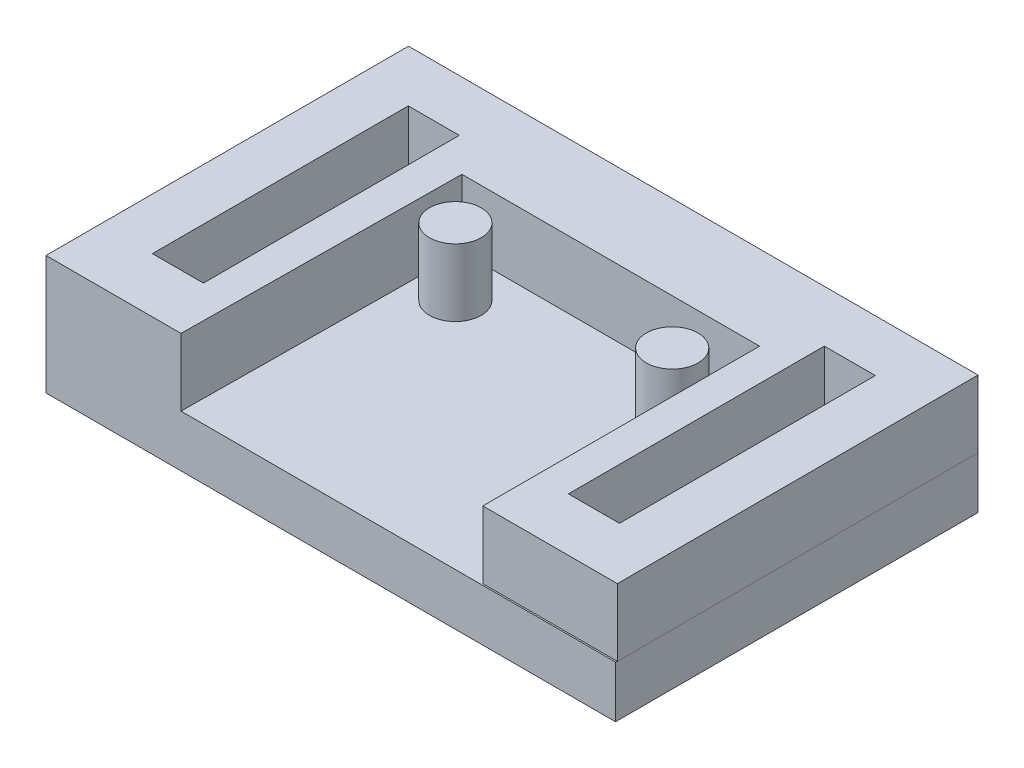
ISO-10303-21;
HEADER;
FILE_DESCRIPTION(('STEP AP214'),'2;1');
FILE_NAME('part.step','',(''),(''),'','','');
FILE_SCHEMA(('AUTOMOTIVE_DESIGN { 1 0 10303 214 1 1 1 1 }'));
ENDSEC;
DATA;
#1=APPLICATION_CONTEXT('core data for automotive mechanical design processes');
#2=APPLICATION_PROTOCOL_DEFINITION('international standard','automotive_design',2000,#1);
#3=PRODUCT_CONTEXT('',#1,'mechanical');
#4=PRODUCT('Part','Part','',(#3));
#5=PRODUCT_RELATED_PRODUCT_CATEGORY('part','',(#4));
#6=PRODUCT_DEFINITION_FORMATION('','',#4);
#7=PRODUCT_DEFINITION_CONTEXT('part definition',#1,'design');
#8=PRODUCT_DEFINITION('design','',#6,#7);
#9=PRODUCT_DEFINITION_SHAPE('','',#8);
#10=(LENGTH_UNIT() NAMED_UNIT(*) SI_UNIT(.MILLI.,.METRE.));
#11=(NAMED_UNIT(*) PLANE_ANGLE_UNIT() SI_UNIT($,.RADIAN.));
#12=(NAMED_UNIT(*) SI_UNIT($,.STERADIAN.) SOLID_ANGLE_UNIT());
#13=UNCERTAINTY_MEASURE_WITH_UNIT(LENGTH_MEASURE(1.E-05),#10,'distance_accuracy_value','');
#14=(GEOMETRIC_REPRESENTATION_CONTEXT(3) GLOBAL_UNCERTAINTY_ASSIGNED_CONTEXT((#13)) GLOBAL_UNIT_ASSIGNED_CONTEXT((#10,
#11,#12)) REPRESENTATION_CONTEXT('',''));
#15=CARTESIAN_POINT('',(0.,0.,0.));
#16=DIRECTION('',(0.,0.,1.));
#17=DIRECTION('',(1.,0.,0.));
#18=AXIS2_PLACEMENT_3D('',#15,#16,#17);
#19=CARTESIAN_POINT('',(0.,2.54,0.));
#20=DIRECTION('',(0.,-1.,0.));
#21=DIRECTION('',(0.,0.,-1.));
#22=AXIS2_PLACEMENT_3D('',#19,#20,#21);
#23=PLANE('',#22);
#24=CARTESIAN_POINT('',(-5.31894104825574,2.54,-2.54));
#25=DIRECTION('',(0.,-1.,0.));
#26=DIRECTION('',(0.,0.,-1.));
#27=AXIS2_PLACEMENT_3D('',#24,#25,#26);
#28=CIRCLE('',#27,1.27);
#29=CARTESIAN_POINT('',(-5.31894104825574,2.54,-3.81));
#30=VERTEX_POINT('',#29);
#31=EDGE_CURVE('E41',#30,#30,#28,.F.);
#32=ORIENTED_EDGE('',*,*,#31,.F.);
#33=EDGE_LOOP('',(#32));
#34=FACE_BOUND('',#33,.T.);
#35=CARTESIAN_POINT('',(5.31894104825574,2.54,-2.54));
#36=DIRECTION('',(0.,-1.,0.));
#37=DIRECTION('',(0.,0.,-1.));
#38=AXIS2_PLACEMENT_3D('',#35,#36,#37);
#39=CIRCLE('',#38,1.27);
#40=CARTESIAN_POINT('',(5.31894104825574,2.54,-3.81));
#41=VERTEX_POINT('',#40);
#42=EDGE_CURVE('E11',#41,#41,#39,.F.);
#43=ORIENTED_EDGE('',*,*,#42,.F.);
#44=EDGE_LOOP('',(#43));
#45=FACE_BOUND('',#44,.T.);
#46=DIRECTION('',(1.,0.,0.));
#47=VECTOR('',#46,1.);
#48=CARTESIAN_POINT('',(13.9882213316105,2.54,8.81711467355781));
#49=LINE('',#48,#47);
#50=CARTESIAN_POINT('',(7.38422133231234,2.54,8.81711467355781));
#51=VERTEX_POINT('',#50);
#52=CARTESIAN_POINT('',(13.97,2.54,8.81711467355781));
#53=VERTEX_POINT('',#52);
#54=EDGE_CURVE('E48',#51,#53,#49,.T.);
#55=ORIENTED_EDGE('',*,*,#54,.F.);
#56=DIRECTION('',(0.,0.,1.));
#57=VECTOR('',#56,1.);
#58=CARTESIAN_POINT('',(7.38422133231234,2.54,8.81711467355781));
#59=LINE('',#58,#57);
#60=CARTESIAN_POINT('',(7.38422133231234,2.54,-4.76033987234333));
#61=VERTEX_POINT('',#60);
#62=EDGE_CURVE('E53',#61,#51,#59,.T.);
#63=ORIENTED_EDGE('',*,*,#62,.F.);
#64=DIRECTION('',(1.,0.,0.));
#65=VECTOR('',#64,1.);
#66=CARTESIAN_POINT('',(-7.21564731777631,2.54,-4.76033987234333));
#67=LINE('',#66,#65);
#68=CARTESIAN_POINT('',(-7.21564731777631,2.54,-4.76033987234333));
#69=VERTEX_POINT('',#68);
#70=EDGE_CURVE('E265',#69,#61,#67,.T.);
#71=ORIENTED_EDGE('',*,*,#70,.F.);
#72=DIRECTION('',(0.00967925791143743,0.,-0.99995315488591));
#73=VECTOR('',#72,1.);
#74=CARTESIAN_POINT('',(-7.21564731777631,2.54,-4.76033987234333));
#75=LINE('',#74,#73);
#76=CARTESIAN_POINT('',(-7.34777866768766,2.54,8.89));
#77=VERTEX_POINT('',#76);
#78=EDGE_CURVE('E288',#77,#69,#75,.T.);
#79=ORIENTED_EDGE('',*,*,#78,.F.);
#80=DIRECTION('',(1.,0.,0.));
#81=VECTOR('',#80,1.);
#82=CARTESIAN_POINT('',(-13.97,2.54,8.89));
#83=LINE('',#82,#81);
#84=CARTESIAN_POINT('',(13.97,2.54,8.89));
#85=VERTEX_POINT('',#84);
#86=EDGE_CURVE('E378',#77,#85,#83,.T.);
#87=ORIENTED_EDGE('',*,*,#86,.T.);
#88=DIRECTION('',(0.,0.,-1.));
#89=VECTOR('',#88,1.);
#90=CARTESIAN_POINT('',(13.97,2.54,8.89));
#91=LINE('',#90,#89);
#92=EDGE_CURVE('E376',#85,#53,#91,.T.);
#93=ORIENTED_EDGE('',*,*,#92,.T.);
#94=EDGE_LOOP('',(#55,#63,#71,#79,#87,#93));
#95=FACE_BOUND('',#94,.T.);
#96=ADVANCED_FACE('F33',(#34,#45,#95),#23,.F.);
#97=CARTESIAN_POINT('',(0.,0.,0.));
#98=DIRECTION('',(0.,-1.,0.));
#99=DIRECTION('',(0.,0.,-1.));
#100=AXIS2_PLACEMENT_3D('',#97,#98,#99);
#101=PLANE('',#100);
#102=DIRECTION('',(0.,0.,-1.));
#103=VECTOR('',#102,1.);
#104=CARTESIAN_POINT('',(13.97,0.,8.89));
#105=LINE('',#104,#103);
#106=CARTESIAN_POINT('',(13.97,0.,8.89));
#107=VERTEX_POINT('',#106);
#108=CARTESIAN_POINT('',(13.97,0.,-8.89));
#109=VERTEX_POINT('',#108);
#110=EDGE_CURVE('E375',#107,#109,#105,.T.);
#111=ORIENTED_EDGE('',*,*,#110,.F.);
#112=DIRECTION('',(1.,0.,0.));
#113=VECTOR('',#112,1.);
#114=CARTESIAN_POINT('',(-13.97,0.,8.89));
#115=LINE('',#114,#113);
#116=CARTESIAN_POINT('',(-13.97,0.,8.89));
#117=VERTEX_POINT('',#116);
#118=EDGE_CURVE('E379',#117,#107,#115,.T.);
#119=ORIENTED_EDGE('',*,*,#118,.F.);
#120=DIRECTION('',(0.,0.,1.));
#121=VECTOR('',#120,1.);
#122=CARTESIAN_POINT('',(-13.97,0.,8.89));
#123=LINE('',#122,#121);
#124=CARTESIAN_POINT('',(-13.97,0.,-8.89));
#125=VERTEX_POINT('',#124);
#126=EDGE_CURVE('E386',#125,#117,#123,.T.);
#127=ORIENTED_EDGE('',*,*,#126,.F.);
#128=DIRECTION('',(-1.,0.,0.));
#129=VECTOR('',#128,1.);
#130=CARTESIAN_POINT('',(-13.97,0.,-8.89));
#131=LINE('',#130,#129);
#132=EDGE_CURVE('E384',#109,#125,#131,.T.);
#133=ORIENTED_EDGE('',*,*,#132,.F.);
#134=EDGE_LOOP('',(#111,#119,#127,#133));
#135=FACE_BOUND('',#134,.T.);
#136=DIRECTION('',(-1.,0.,0.));
#137=VECTOR('',#136,1.);
#138=CARTESIAN_POINT('',(-8.93489898989899,0.,-6.35));
#139=LINE('',#138,#137);
#140=CARTESIAN_POINT('',(-8.93489898989899,0.,-6.35));
#141=VERTEX_POINT('',#140);
#142=CARTESIAN_POINT('',(-11.474898989899,0.,-6.35));
#143=VERTEX_POINT('',#142);
#144=EDGE_CURVE('E349',#141,#143,#139,.T.);
#145=ORIENTED_EDGE('',*,*,#144,.T.);
#146=DIRECTION('',(0.,0.,1.));
#147=VECTOR('',#146,1.);
#148=CARTESIAN_POINT('',(-11.474898989899,0.,6.35));
#149=LINE('',#148,#147);
#150=CARTESIAN_POINT('',(-11.474898989899,0.,6.35));
#151=VERTEX_POINT('',#150);
#152=EDGE_CURVE('E344',#143,#151,#149,.T.);
#153=ORIENTED_EDGE('',*,*,#152,.T.);
#154=DIRECTION('',(1.,0.,0.));
#155=VECTOR('',#154,1.);
#156=CARTESIAN_POINT('',(-8.93489898989899,0.,6.35));
#157=LINE('',#156,#155);
#158=CARTESIAN_POINT('',(-8.93489898989899,0.,6.35));
#159=VERTEX_POINT('',#158);
#160=EDGE_CURVE('E358',#151,#159,#157,.T.);
#161=ORIENTED_EDGE('',*,*,#160,.T.);
#162=DIRECTION('',(0.,0.,-1.));
#163=VECTOR('',#162,1.);
#164=CARTESIAN_POINT('',(-8.93489898989899,0.,6.35));
#165=LINE('',#164,#163);
#166=EDGE_CURVE('E361',#159,#141,#165,.T.);
#167=ORIENTED_EDGE('',*,*,#166,.T.);
#168=EDGE_LOOP('',(#145,#153,#161,#167));
#169=FACE_BOUND('',#168,.T.);
#170=DIRECTION('',(-1.,0.,0.));
#171=VECTOR('',#170,1.);
#172=CARTESIAN_POINT('',(8.93489898989895,0.,-6.35));
#173=LINE('',#172,#171);
#174=CARTESIAN_POINT('',(11.4748989898989,0.,-6.35));
#175=VERTEX_POINT('',#174);
#176=CARTESIAN_POINT('',(8.93489898989895,0.,-6.35));
#177=VERTEX_POINT('',#176);
#178=EDGE_CURVE('E202',#175,#177,#173,.T.);
#179=ORIENTED_EDGE('',*,*,#178,.T.);
#180=DIRECTION('',(0.,0.,1.));
#181=VECTOR('',#180,1.);
#182=CARTESIAN_POINT('',(8.93489898989903,0.,6.35));
#183=LINE('',#182,#181);
#184=CARTESIAN_POINT('',(8.93489898989903,0.,6.35));
#185=VERTEX_POINT('',#184);
#186=EDGE_CURVE('E319',#177,#185,#183,.T.);
#187=ORIENTED_EDGE('',*,*,#186,.T.);
#188=DIRECTION('',(1.,0.,0.));
#189=VECTOR('',#188,1.);
#190=CARTESIAN_POINT('',(8.93489898989903,0.,6.35));
#191=LINE('',#190,#189);
#192=CARTESIAN_POINT('',(11.474898989899,0.,6.35));
#193=VERTEX_POINT('',#192);
#194=EDGE_CURVE('E333',#185,#193,#191,.T.);
#195=ORIENTED_EDGE('',*,*,#194,.T.);
#196=DIRECTION('',(0.,0.,-1.));
#197=VECTOR('',#196,1.);
#198=CARTESIAN_POINT('',(11.474898989899,0.,6.35));
#199=LINE('',#198,#197);
#200=EDGE_CURVE('E336',#193,#175,#199,.T.);
#201=ORIENTED_EDGE('',*,*,#200,.T.);
#202=EDGE_LOOP('',(#179,#187,#195,#201));
#203=FACE_BOUND('',#202,.T.);
#204=ADVANCED_FACE('F406',(#135,#169,#203),#101,.T.);
#205=CARTESIAN_POINT('',(13.97,2.54,8.89));
#206=DIRECTION('',(-1.,0.,0.));
#207=DIRECTION('',(0.,0.,1.));
#208=AXIS2_PLACEMENT_3D('',#205,#206,#207);
#209=PLANE('',#208);
#210=ORIENTED_EDGE('',*,*,#110,.T.);
#211=DIRECTION('',(0.,-1.,0.));
#212=VECTOR('',#211,1.);
#213=CARTESIAN_POINT('',(13.97,2.54,-8.89));
#214=LINE('',#213,#212);
#215=CARTESIAN_POINT('',(13.97,2.54,-8.89));
#216=VERTEX_POINT('',#215);
#217=EDGE_CURVE('E397',#216,#109,#214,.T.);
#218=ORIENTED_EDGE('',*,*,#217,.F.);
#219=DIRECTION('',(0.,0.,1.));
#220=VECTOR('',#219,1.);
#221=CARTESIAN_POINT('',(13.97,2.54,8.89));
#222=LINE('',#221,#220);
#223=EDGE_CURVE('E311',#216,#53,#222,.T.);
#224=ORIENTED_EDGE('',*,*,#223,.T.);
#225=ORIENTED_EDGE('',*,*,#92,.F.);
#226=DIRECTION('',(0.,-1.,0.));
#227=VECTOR('',#226,1.);
#228=CARTESIAN_POINT('',(13.97,2.54,8.89));
#229=LINE('',#228,#227);
#230=EDGE_CURVE('E381',#85,#107,#229,.T.);
#231=ORIENTED_EDGE('',*,*,#230,.T.);
#232=EDGE_LOOP('',(#210,#218,#224,#225,#231));
#233=FACE_BOUND('',#232,.T.);
#234=ADVANCED_FACE('F35',(#233),#209,.F.);
#235=CARTESIAN_POINT('',(-13.97,2.54,-8.89));
#236=DIRECTION('',(0.,0.,1.));
#237=DIRECTION('',(1.,0.,0.));
#238=AXIS2_PLACEMENT_3D('',#235,#236,#237);
#239=PLANE('',#238);
#240=ORIENTED_EDGE('',*,*,#132,.T.);
#241=DIRECTION('',(0.,-1.,0.));
#242=VECTOR('',#241,1.);
#243=CARTESIAN_POINT('',(-13.97,2.54,-8.89));
#244=LINE('',#243,#242);
#245=CARTESIAN_POINT('',(-13.97,5.842,-8.89));
#246=VERTEX_POINT('',#245);
#247=EDGE_CURVE('E394',#246,#125,#244,.T.);
#248=ORIENTED_EDGE('',*,*,#247,.F.);
#249=DIRECTION('',(-1.,0.,0.));
#250=VECTOR('',#249,1.);
#251=CARTESIAN_POINT('',(-13.97,5.842,-8.89));
#252=LINE('',#251,#250);
#253=CARTESIAN_POINT('',(13.97,5.842,-8.89));
#254=VERTEX_POINT('',#253);
#255=EDGE_CURVE('E269',#254,#246,#252,.T.);
#256=ORIENTED_EDGE('',*,*,#255,.F.);
#257=DIRECTION('',(0.,-1.,0.));
#258=VECTOR('',#257,1.);
#259=CARTESIAN_POINT('',(13.97,5.842,-8.89));
#260=LINE('',#259,#258);
#261=EDGE_CURVE('E300',#254,#216,#260,.T.);
#262=ORIENTED_EDGE('',*,*,#261,.T.);
#263=ORIENTED_EDGE('',*,*,#217,.T.);
#264=EDGE_LOOP('',(#240,#248,#256,#262,#263));
#265=FACE_BOUND('',#264,.T.);
#266=ADVANCED_FACE('F468',(#265),#239,.F.);
#267=CARTESIAN_POINT('',(-13.97,2.54,8.89));
#268=DIRECTION('',(1.,0.,0.));
#269=DIRECTION('',(0.,0.,-1.));
#270=AXIS2_PLACEMENT_3D('',#267,#268,#269);
#271=PLANE('',#270);
#272=ORIENTED_EDGE('',*,*,#126,.T.);
#273=DIRECTION('',(0.,-1.,0.));
#274=VECTOR('',#273,1.);
#275=CARTESIAN_POINT('',(-13.97,2.54,8.89));
#276=LINE('',#275,#274);
#277=CARTESIAN_POINT('',(-13.97,5.842,8.89));
#278=VERTEX_POINT('',#277);
#279=EDGE_CURVE('E391',#278,#117,#276,.T.);
#280=ORIENTED_EDGE('',*,*,#279,.F.);
#281=DIRECTION('',(0.,0.,1.));
#282=VECTOR('',#281,1.);
#283=CARTESIAN_POINT('',(-13.97,5.842,8.89));
#284=LINE('',#283,#282);
#285=EDGE_CURVE('E272',#246,#278,#284,.T.);
#286=ORIENTED_EDGE('',*,*,#285,.F.);
#287=ORIENTED_EDGE('',*,*,#247,.T.);
#288=EDGE_LOOP('',(#272,#280,#286,#287));
#289=FACE_BOUND('',#288,.T.);
#290=ADVANCED_FACE('F465',(#289),#271,.F.);
#291=CARTESIAN_POINT('',(-13.97,2.54,8.89));
#292=DIRECTION('',(0.,0.,-1.));
#293=DIRECTION('',(-1.,0.,0.));
#294=AXIS2_PLACEMENT_3D('',#291,#292,#293);
#295=PLANE('',#294);
#296=ORIENTED_EDGE('',*,*,#118,.T.);
#297=ORIENTED_EDGE('',*,*,#230,.F.);
#298=ORIENTED_EDGE('',*,*,#86,.F.);
#299=DIRECTION('',(0.,-1.,0.));
#300=VECTOR('',#299,1.);
#301=CARTESIAN_POINT('',(-7.34777866768766,5.842,8.89));
#302=LINE('',#301,#300);
#303=CARTESIAN_POINT('',(-7.34777866768766,5.842,8.89));
#304=VERTEX_POINT('',#303);
#305=EDGE_CURVE('E297',#304,#77,#302,.T.);
#306=ORIENTED_EDGE('',*,*,#305,.F.);
#307=DIRECTION('',(1.,0.,0.));
#308=VECTOR('',#307,1.);
#309=CARTESIAN_POINT('',(-7.34777866768766,5.842,8.89));
#310=LINE('',#309,#308);
#311=EDGE_CURVE('E275',#278,#304,#310,.T.);
#312=ORIENTED_EDGE('',*,*,#311,.F.);
#313=ORIENTED_EDGE('',*,*,#279,.T.);
#314=EDGE_LOOP('',(#296,#297,#298,#306,#312,#313));
#315=FACE_BOUND('',#314,.T.);
#316=ADVANCED_FACE('F457',(#315),#295,.F.);
#317=CARTESIAN_POINT('',(-11.474898989899,2.54,6.35));
#318=DIRECTION('',(1.,0.,0.));
#319=DIRECTION('',(0.,0.,-1.));
#320=AXIS2_PLACEMENT_3D('',#317,#318,#319);
#321=PLANE('',#320);
#322=ORIENTED_EDGE('',*,*,#152,.F.);
#323=DIRECTION('',(0.,-1.,0.));
#324=VECTOR('',#323,1.);
#325=CARTESIAN_POINT('',(-11.474898989899,2.54,-6.35));
#326=LINE('',#325,#324);
#327=CARTESIAN_POINT('',(-11.474898989899,2.54,-6.35));
#328=VERTEX_POINT('',#327);
#329=EDGE_CURVE('E355',#328,#143,#326,.T.);
#330=ORIENTED_EDGE('',*,*,#329,.F.);
#331=DIRECTION('',(0.,0.,1.));
#332=VECTOR('',#331,1.);
#333=CARTESIAN_POINT('',(-11.474898989899,2.54,6.35));
#334=LINE('',#333,#332);
#335=CARTESIAN_POINT('',(-11.474898989899,2.54,6.35));
#336=VERTEX_POINT('',#335);
#337=EDGE_CURVE('E345',#328,#336,#334,.T.);
#338=ORIENTED_EDGE('',*,*,#337,.T.);
#339=DIRECTION('',(0.,-1.,0.));
#340=VECTOR('',#339,1.);
#341=CARTESIAN_POINT('',(-11.474898989899,2.54,6.35));
#342=LINE('',#341,#340);
#343=EDGE_CURVE('E372',#336,#151,#342,.T.);
#344=ORIENTED_EDGE('',*,*,#343,.T.);
#345=EDGE_LOOP('',(#322,#330,#338,#344));
#346=FACE_BOUND('',#345,.T.);
#347=ADVANCED_FACE('F454',(#346),#321,.T.);
#348=CARTESIAN_POINT('',(-8.93489898989899,2.54,6.35));
#349=DIRECTION('',(0.,0.,-1.));
#350=DIRECTION('',(-1.,0.,0.));
#351=AXIS2_PLACEMENT_3D('',#348,#349,#350);
#352=PLANE('',#351);
#353=ORIENTED_EDGE('',*,*,#160,.F.);
#354=ORIENTED_EDGE('',*,*,#343,.F.);
#355=DIRECTION('',(1.,0.,0.));
#356=VECTOR('',#355,1.);
#357=CARTESIAN_POINT('',(-8.93489898989899,2.54,6.35));
#358=LINE('',#357,#356);
#359=CARTESIAN_POINT('',(-8.93489898989899,2.54,6.35));
#360=VERTEX_POINT('',#359);
#361=EDGE_CURVE('E348',#336,#360,#358,.T.);
#362=ORIENTED_EDGE('',*,*,#361,.T.);
#363=DIRECTION('',(0.,-1.,0.));
#364=VECTOR('',#363,1.);
#365=CARTESIAN_POINT('',(-8.93489898989899,2.54,6.35));
#366=LINE('',#365,#364);
#367=EDGE_CURVE('E370',#360,#159,#366,.T.);
#368=ORIENTED_EDGE('',*,*,#367,.T.);
#369=EDGE_LOOP('',(#353,#354,#362,#368));
#370=FACE_BOUND('',#369,.T.);
#371=ADVANCED_FACE('F450',(#370),#352,.T.);
#372=CARTESIAN_POINT('',(-8.93489898989899,2.54,6.35));
#373=DIRECTION('',(-1.,0.,0.));
#374=DIRECTION('',(0.,0.,1.));
#375=AXIS2_PLACEMENT_3D('',#372,#373,#374);
#376=PLANE('',#375);
#377=ORIENTED_EDGE('',*,*,#166,.F.);
#378=ORIENTED_EDGE('',*,*,#367,.F.);
#379=DIRECTION('',(0.,0.,-1.));
#380=VECTOR('',#379,1.);
#381=CARTESIAN_POINT('',(-8.93489898989899,2.54,6.35));
#382=LINE('',#381,#380);
#383=CARTESIAN_POINT('',(-8.93489898989899,2.54,6.20422934711563));
#384=VERTEX_POINT('',#383);
#385=EDGE_CURVE('E352',#360,#384,#382,.T.);
#386=ORIENTED_EDGE('',*,*,#385,.T.);
#387=DIRECTION('',(0.,-1.,0.));
#388=VECTOR('',#387,1.);
#389=CARTESIAN_POINT('',(-8.93489898989899,5.842,6.20422934711563));
#390=LINE('',#389,#388);
#391=CARTESIAN_POINT('',(-8.93489898989899,5.842,6.20422934711563));
#392=VERTEX_POINT('',#391);
#393=EDGE_CURVE('E250',#392,#384,#390,.T.);
#394=ORIENTED_EDGE('',*,*,#393,.F.);
#395=DIRECTION('',(0.,0.,-1.));
#396=VECTOR('',#395,1.);
#397=CARTESIAN_POINT('',(-8.93489898989899,5.842,6.20422934711563));
#398=LINE('',#397,#396);
#399=CARTESIAN_POINT('',(-8.93489898989899,5.842,-6.35));
#400=VERTEX_POINT('',#399);
#401=EDGE_CURVE('E239',#392,#400,#398,.T.);
#402=ORIENTED_EDGE('',*,*,#401,.T.);
#403=DIRECTION('',(0.,-1.,0.));
#404=VECTOR('',#403,1.);
#405=CARTESIAN_POINT('',(-8.93489898989899,2.54,-6.35));
#406=LINE('',#405,#404);
#407=EDGE_CURVE('E368',#400,#141,#406,.T.);
#408=ORIENTED_EDGE('',*,*,#407,.T.);
#409=EDGE_LOOP('',(#377,#378,#386,#394,#402,#408));
#410=FACE_BOUND('',#409,.T.);
#411=ADVANCED_FACE('F446',(#410),#376,.T.);
#412=CARTESIAN_POINT('',(-8.93489898989899,2.54,-6.35));
#413=DIRECTION('',(0.,0.,1.));
#414=DIRECTION('',(1.,0.,0.));
#415=AXIS2_PLACEMENT_3D('',#412,#413,#414);
#416=PLANE('',#415);
#417=ORIENTED_EDGE('',*,*,#144,.F.);
#418=ORIENTED_EDGE('',*,*,#407,.F.);
#419=DIRECTION('',(-1.,0.,0.));
#420=VECTOR('',#419,1.);
#421=CARTESIAN_POINT('',(-11.4384563266779,5.842,-6.35));
#422=LINE('',#421,#420);
#423=CARTESIAN_POINT('',(-11.4384563266779,5.842,-6.35));
#424=VERTEX_POINT('',#423);
#425=EDGE_CURVE('E242',#400,#424,#422,.T.);
#426=ORIENTED_EDGE('',*,*,#425,.T.);
#427=DIRECTION('',(0.,-1.,0.));
#428=VECTOR('',#427,1.);
#429=CARTESIAN_POINT('',(-11.4384563266779,5.842,-6.35));
#430=LINE('',#429,#428);
#431=CARTESIAN_POINT('',(-11.4384563266779,2.54,-6.35));
#432=VERTEX_POINT('',#431);
#433=EDGE_CURVE('E258',#424,#432,#430,.T.);
#434=ORIENTED_EDGE('',*,*,#433,.T.);
#435=DIRECTION('',(1.,0.,0.));
#436=VECTOR('',#435,1.);
#437=CARTESIAN_POINT('',(-8.93489898989899,2.54,-6.35));
#438=LINE('',#437,#436);
#439=EDGE_CURVE('E308',#328,#432,#438,.T.);
#440=ORIENTED_EDGE('',*,*,#439,.F.);
#441=ORIENTED_EDGE('',*,*,#329,.T.);
#442=EDGE_LOOP('',(#417,#418,#426,#434,#440,#441));
#443=FACE_BOUND('',#442,.T.);
#444=ADVANCED_FACE('F442',(#443),#416,.T.);
#445=CARTESIAN_POINT('',(8.93489898989903,2.54,6.35));
#446=DIRECTION('',(1.,0.,0.));
#447=DIRECTION('',(0.,0.,-1.));
#448=AXIS2_PLACEMENT_3D('',#445,#446,#447);
#449=PLANE('',#448);
#450=ORIENTED_EDGE('',*,*,#186,.F.);
#451=DIRECTION('',(0.,-1.,0.));
#452=VECTOR('',#451,1.);
#453=CARTESIAN_POINT('',(8.93489898989895,2.54,-6.35));
#454=LINE('',#453,#452);
#455=CARTESIAN_POINT('',(8.93489898989895,2.54,-6.35));
#456=VERTEX_POINT('',#455);
#457=EDGE_CURVE('E207',#456,#177,#454,.T.);
#458=ORIENTED_EDGE('',*,*,#457,.F.);
#459=DIRECTION('',(0.,0.,1.));
#460=VECTOR('',#459,1.);
#461=CARTESIAN_POINT('',(8.93489898989903,2.54,6.35));
#462=LINE('',#461,#460);
#463=CARTESIAN_POINT('',(8.93489898989903,2.54,6.35));
#464=VERTEX_POINT('',#463);
#465=EDGE_CURVE('E320',#456,#464,#462,.T.);
#466=ORIENTED_EDGE('',*,*,#465,.T.);
#467=DIRECTION('',(0.,-1.,0.));
#468=VECTOR('',#467,1.);
#469=CARTESIAN_POINT('',(8.93489898989903,2.54,6.35));
#470=LINE('',#469,#468);
#471=EDGE_CURVE('E341',#464,#185,#470,.T.);
#472=ORIENTED_EDGE('',*,*,#471,.T.);
#473=EDGE_LOOP('',(#450,#458,#466,#472));
#474=FACE_BOUND('',#473,.T.);
#475=ADVANCED_FACE('F438',(#474),#449,.T.);
#476=CARTESIAN_POINT('',(8.93489898989903,2.54,6.35));
#477=DIRECTION('',(0.,0.,-1.));
#478=DIRECTION('',(-1.,0.,0.));
#479=AXIS2_PLACEMENT_3D('',#476,#477,#478);
#480=PLANE('',#479);
#481=ORIENTED_EDGE('',*,*,#194,.F.);
#482=ORIENTED_EDGE('',*,*,#471,.F.);
#483=DIRECTION('',(1.,0.,0.));
#484=VECTOR('',#483,1.);
#485=CARTESIAN_POINT('',(8.93489898989903,2.54,6.35));
#486=LINE('',#485,#484);
#487=CARTESIAN_POINT('',(11.474898989899,2.54,6.35));
#488=VERTEX_POINT('',#487);
#489=EDGE_CURVE('E323',#464,#488,#486,.T.);
#490=ORIENTED_EDGE('',*,*,#489,.T.);
#491=DIRECTION('',(0.,-1.,0.));
#492=VECTOR('',#491,1.);
#493=CARTESIAN_POINT('',(11.474898989899,2.54,6.35));
#494=LINE('',#493,#492);
#495=EDGE_CURVE('E206',#488,#193,#494,.T.);
#496=ORIENTED_EDGE('',*,*,#495,.T.);
#497=EDGE_LOOP('',(#481,#482,#490,#496));
#498=FACE_BOUND('',#497,.T.);
#499=ADVANCED_FACE('F435',(#498),#480,.T.);
#500=CARTESIAN_POINT('',(11.474898989899,2.54,6.35));
#501=DIRECTION('',(-1.,0.,0.));
#502=DIRECTION('',(0.,0.,1.));
#503=AXIS2_PLACEMENT_3D('',#500,#501,#502);
#504=PLANE('',#503);
#505=ORIENTED_EDGE('',*,*,#200,.F.);
#506=ORIENTED_EDGE('',*,*,#495,.F.);
#507=DIRECTION('',(0.,0.,-1.));
#508=VECTOR('',#507,1.);
#509=CARTESIAN_POINT('',(11.474898989899,2.54,6.35));
#510=LINE('',#509,#508);
#511=CARTESIAN_POINT('',(11.474898989899,2.54,6.20422934711559));
#512=VERTEX_POINT('',#511);
#513=EDGE_CURVE('E326',#488,#512,#510,.T.);
#514=ORIENTED_EDGE('',*,*,#513,.T.);
#515=DIRECTION('',(0.,-1.,0.));
#516=VECTOR('',#515,1.);
#517=CARTESIAN_POINT('',(11.474898989899,5.842,6.20422934711559));
#518=LINE('',#517,#516);
#519=CARTESIAN_POINT('',(11.474898989899,5.842,6.20422934711559));
#520=VERTEX_POINT('',#519);
#521=EDGE_CURVE('E214',#520,#512,#518,.T.);
#522=ORIENTED_EDGE('',*,*,#521,.F.);
#523=DIRECTION('',(0.,0.,-1.));
#524=VECTOR('',#523,1.);
#525=CARTESIAN_POINT('',(11.474898989899,5.842,6.20422934711559));
#526=LINE('',#525,#524);
#527=CARTESIAN_POINT('',(11.474898989899,5.842,-6.35000000000003));
#528=VERTEX_POINT('',#527);
#529=EDGE_CURVE('E211',#520,#528,#526,.T.);
#530=ORIENTED_EDGE('',*,*,#529,.T.);
#531=DIRECTION('',(0.,-1.,0.));
#532=VECTOR('',#531,1.);
#533=CARTESIAN_POINT('',(11.4748989898989,2.54,-6.35));
#534=LINE('',#533,#532);
#535=EDGE_CURVE('E193',#528,#175,#534,.T.);
#536=ORIENTED_EDGE('',*,*,#535,.T.);
#537=EDGE_LOOP('',(#505,#506,#514,#522,#530,#536));
#538=FACE_BOUND('',#537,.T.);
#539=ADVANCED_FACE('F212',(#538),#504,.T.);
#540=CARTESIAN_POINT('',(8.93489898989895,2.54,-6.35));
#541=DIRECTION('',(0.,0.,1.));
#542=DIRECTION('',(1.,0.,0.));
#543=AXIS2_PLACEMENT_3D('',#540,#541,#542);
#544=PLANE('',#543);
#545=ORIENTED_EDGE('',*,*,#178,.F.);
#546=ORIENTED_EDGE('',*,*,#535,.F.);
#547=DIRECTION('',(-1.,0.,0.));
#548=VECTOR('',#547,1.);
#549=CARTESIAN_POINT('',(11.474898989899,5.842,-6.35000000000003));
#550=LINE('',#549,#548);
#551=CARTESIAN_POINT('',(8.97134165312008,5.842,-6.35000000000002));
#552=VERTEX_POINT('',#551);
#553=EDGE_CURVE('E198',#528,#552,#550,.T.);
#554=ORIENTED_EDGE('',*,*,#553,.T.);
#555=DIRECTION('',(0.,-1.,0.));
#556=VECTOR('',#555,1.);
#557=CARTESIAN_POINT('',(8.97134165312008,5.842,-6.35000000000002));
#558=LINE('',#557,#556);
#559=CARTESIAN_POINT('',(8.97134165312008,2.54,-6.35));
#560=VERTEX_POINT('',#559);
#561=EDGE_CURVE('E236',#552,#560,#558,.T.);
#562=ORIENTED_EDGE('',*,*,#561,.T.);
#563=DIRECTION('',(-1.,0.,0.));
#564=VECTOR('',#563,1.);
#565=CARTESIAN_POINT('',(8.93489898989895,2.54,-6.35));
#566=LINE('',#565,#564);
#567=EDGE_CURVE('E328',#560,#456,#566,.T.);
#568=ORIENTED_EDGE('',*,*,#567,.T.);
#569=ORIENTED_EDGE('',*,*,#457,.T.);
#570=EDGE_LOOP('',(#545,#546,#554,#562,#568,#569));
#571=FACE_BOUND('',#570,.T.);
#572=ADVANCED_FACE('F195',(#571),#544,.T.);
#573=CARTESIAN_POINT('',(-5.31894104825574,5.842,-2.54));
#574=DIRECTION('',(0.,-1.,0.));
#575=DIRECTION('',(0.,0.,-1.));
#576=AXIS2_PLACEMENT_3D('',#573,#574,#575);
#577=CYLINDRICAL_SURFACE('',#576,1.27);
#578=CARTESIAN_POINT('',(-5.31894104825574,5.842,-2.54));
#579=DIRECTION('',(0.,1.,0.));
#580=DIRECTION('',(0.,0.,1.));
#581=AXIS2_PLACEMENT_3D('',#578,#579,#580);
#582=CIRCLE('',#581,1.27);
#583=CARTESIAN_POINT('',(-5.31894104825574,5.842,-3.81));
#584=VERTEX_POINT('',#583);
#585=EDGE_CURVE('E316',#584,#584,#582,.T.);
#586=CARTESIAN_POINT('',(-5.31894104825574,5.842,-3.81));
#587=CARTESIAN_POINT('',(-5.31894104825574,5.80760416666667,-3.81));
#588=CARTESIAN_POINT('',(-5.31894104825574,5.77320833333333,-3.81));
#589=CARTESIAN_POINT('',(-5.31894104825574,5.70441666666667,-3.81));
#590=CARTESIAN_POINT('',(-5.31894104825574,5.67002083333333,-3.81));
#591=CARTESIAN_POINT('',(-5.31894104825574,5.60122916666667,-3.81));
#592=CARTESIAN_POINT('',(-5.31894104825574,5.56683333333333,-3.81));
#593=CARTESIAN_POINT('',(-5.31894104825574,5.49804166666667,-3.81));
#594=CARTESIAN_POINT('',(-5.31894104825574,5.46364583333333,-3.81));
#595=CARTESIAN_POINT('',(-5.31894104825574,5.39485416666667,-3.81));
#596=CARTESIAN_POINT('',(-5.31894104825574,5.36045833333333,-3.81));
#597=CARTESIAN_POINT('',(-5.31894104825574,5.29166666666667,-3.81));
#598=CARTESIAN_POINT('',(-5.31894104825574,5.25727083333333,-3.81));
#599=CARTESIAN_POINT('',(-5.31894104825574,5.18847916666667,-3.81));
#600=CARTESIAN_POINT('',(-5.31894104825574,5.15408333333333,-3.81));
#601=CARTESIAN_POINT('',(-5.31894104825574,5.08529166666667,-3.81));
#602=CARTESIAN_POINT('',(-5.31894104825574,5.05089583333333,-3.81));
#603=CARTESIAN_POINT('',(-5.31894104825574,4.98210416666667,-3.81));
#604=CARTESIAN_POINT('',(-5.31894104825574,4.94770833333333,-3.81));
#605=CARTESIAN_POINT('',(-5.31894104825574,4.87891666666667,-3.81));
#606=CARTESIAN_POINT('',(-5.31894104825574,4.84452083333333,-3.81));
#607=CARTESIAN_POINT('',(-5.31894104825574,4.77572916666667,-3.81));
#608=CARTESIAN_POINT('',(-5.31894104825574,4.74133333333333,-3.81));
#609=CARTESIAN_POINT('',(-5.31894104825574,4.67254166666667,-3.81));
#610=CARTESIAN_POINT('',(-5.31894104825574,4.63814583333333,-3.81));
#611=CARTESIAN_POINT('',(-5.31894104825574,4.56935416666667,-3.81));
#612=CARTESIAN_POINT('',(-5.31894104825574,4.53495833333333,-3.81));
#613=CARTESIAN_POINT('',(-5.31894104825574,4.46616666666667,-3.81));
#614=CARTESIAN_POINT('',(-5.31894104825574,4.43177083333333,-3.81));
#615=CARTESIAN_POINT('',(-5.31894104825574,4.36297916666667,-3.81));
#616=CARTESIAN_POINT('',(-5.31894104825574,4.32858333333333,-3.81));
#617=CARTESIAN_POINT('',(-5.31894104825574,4.25979166666667,-3.81));
#618=CARTESIAN_POINT('',(-5.31894104825574,4.22539583333333,-3.81));
#619=CARTESIAN_POINT('',(-5.31894104825574,4.15660416666667,-3.81));
#620=CARTESIAN_POINT('',(-5.31894104825574,4.12220833333333,-3.81));
#621=CARTESIAN_POINT('',(-5.31894104825574,4.05341666666667,-3.81));
#622=CARTESIAN_POINT('',(-5.31894104825574,4.01902083333333,-3.81));
#623=CARTESIAN_POINT('',(-5.31894104825574,3.95022916666667,-3.81));
#624=CARTESIAN_POINT('',(-5.31894104825574,3.91583333333333,-3.81));
#625=CARTESIAN_POINT('',(-5.31894104825574,3.84704166666667,-3.81));
#626=CARTESIAN_POINT('',(-5.31894104825574,3.81264583333333,-3.81));
#627=CARTESIAN_POINT('',(-5.31894104825574,3.74385416666667,-3.81));
#628=CARTESIAN_POINT('',(-5.31894104825574,3.70945833333333,-3.81));
#629=CARTESIAN_POINT('',(-5.31894104825574,3.64066666666667,-3.81));
#630=CARTESIAN_POINT('',(-5.31894104825574,3.60627083333333,-3.81));
#631=CARTESIAN_POINT('',(-5.31894104825574,3.53747916666667,-3.81));
#632=CARTESIAN_POINT('',(-5.31894104825574,3.50308333333333,-3.81));
#633=CARTESIAN_POINT('',(-5.31894104825574,3.43429166666667,-3.81));
#634=CARTESIAN_POINT('',(-5.31894104825574,3.39989583333333,-3.81));
#635=CARTESIAN_POINT('',(-5.31894104825574,3.33110416666667,-3.81));
#636=CARTESIAN_POINT('',(-5.31894104825574,3.29670833333333,-3.81));
#637=CARTESIAN_POINT('',(-5.31894104825574,3.22791666666667,-3.81));
#638=CARTESIAN_POINT('',(-5.31894104825574,3.19352083333333,-3.81));
#639=CARTESIAN_POINT('',(-5.31894104825574,3.12472916666667,-3.81));
#640=CARTESIAN_POINT('',(-5.31894104825574,3.09033333333333,-3.81));
#641=CARTESIAN_POINT('',(-5.31894104825574,3.02154166666667,-3.81));
#642=CARTESIAN_POINT('',(-5.31894104825574,2.98714583333333,-3.81));
#643=CARTESIAN_POINT('',(-5.31894104825574,2.91835416666667,-3.81));
#644=CARTESIAN_POINT('',(-5.31894104825574,2.88395833333333,-3.81));
#645=CARTESIAN_POINT('',(-5.31894104825574,2.81516666666667,-3.81));
#646=CARTESIAN_POINT('',(-5.31894104825574,2.78077083333333,-3.81));
#647=CARTESIAN_POINT('',(-5.31894104825574,2.71197916666667,-3.81));
#648=CARTESIAN_POINT('',(-5.31894104825574,2.67758333333333,-3.81));
#649=CARTESIAN_POINT('',(-5.31894104825574,2.60879166666667,-3.81));
#650=CARTESIAN_POINT('',(-5.31894104825574,2.57439583333333,-3.81));
#651=CARTESIAN_POINT('',(-5.31894104825574,2.54,-3.81));
#652=B_SPLINE_CURVE_WITH_KNOTS('',3,(#586,#587,#588,#589,#590,#591,#592,#593,#594,#595,#596,
#597,#598,#599,#600,#601,#602,#603,#604,#605,#606,#607,#608,#609,#610,#611,#612,#613,#614,#615,
#616,#617,#618,#619,#620,#621,#622,#623,#624,#625,#626,#627,#628,#629,#630,#631,#632,#633,#634,
#635,#636,#637,#638,#639,#640,#641,#642,#643,#644,#645,#646,#647,#648,#649,#650,#651),
.UNSPECIFIED.,.F.,.F.,(4,2,2,2,2,2,2,2,2,2,2,2,2,2,2,2,2,2,2,2,2,2,2,2,2,2,2,2,2,2,2,2,4),(0.,
0.103187500000001,0.206375,0.309562500000001,0.41275,0.515937500000001,0.619125,
0.722312500000001,0.8255,0.928687500000001,1.031875,1.1350625,1.23825,1.3414375,1.444625,
1.5478125,1.651,1.7541875,1.857375,1.9605625,2.06375,2.1669375,2.270125,2.3733125,2.4765,
2.5796875,2.682875,2.7860625,2.88925,2.9924375,3.095625,3.1988125,3.302),.UNSPECIFIED.);
#653=EDGE_CURVE('BSEAM402',#584,#30,#652,.T.);
#654=ORIENTED_EDGE('',*,*,#585,.F.);
#655=ORIENTED_EDGE('',*,*,#31,.T.);
#656=ORIENTED_EDGE('',*,*,#653,.T.);
#657=ORIENTED_EDGE('',*,*,#653,.F.);
#658=EDGE_LOOP('',(#654,#656,#655,#657));
#659=FACE_BOUND('',#658,.T.);
#660=ADVANCED_FACE('F402',(#659),#577,.T.);
#661=CARTESIAN_POINT('',(-5.31894104825574,5.842,-2.54));
#662=DIRECTION('',(0.,1.,0.));
#663=DIRECTION('',(0.,0.,1.));
#664=AXIS2_PLACEMENT_3D('',#661,#662,#663);
#665=PLANE('',#664);
#666=ORIENTED_EDGE('',*,*,#585,.T.);
#667=EDGE_LOOP('',(#666));
#668=FACE_BOUND('',#667,.T.);
#669=ADVANCED_FACE('F413',(#668),#665,.T.);
#670=CARTESIAN_POINT('',(5.31894104825574,5.842,-2.54));
#671=DIRECTION('',(0.,-1.,0.));
#672=DIRECTION('',(0.,0.,-1.));
#673=AXIS2_PLACEMENT_3D('',#670,#671,#672);
#674=CYLINDRICAL_SURFACE('',#673,1.27);
#675=CARTESIAN_POINT('',(5.31894104825574,5.842,-2.54));
#676=DIRECTION('',(0.,1.,0.));
#677=DIRECTION('',(0.,0.,-1.));
#678=AXIS2_PLACEMENT_3D('',#675,#676,#677);
#679=CIRCLE('',#678,1.27);
#680=CARTESIAN_POINT('',(5.31894104825574,5.842,-3.81));
#681=VERTEX_POINT('',#680);
#682=EDGE_CURVE('E313',#681,#681,#679,.T.);
#683=CARTESIAN_POINT('',(5.31894104825574,5.842,-3.81));
#684=CARTESIAN_POINT('',(5.31894104825574,5.80760416666667,-3.81));
#685=CARTESIAN_POINT('',(5.31894104825574,5.77320833333333,-3.81));
#686=CARTESIAN_POINT('',(5.31894104825574,5.70441666666667,-3.81));
#687=CARTESIAN_POINT('',(5.31894104825574,5.67002083333333,-3.81));
#688=CARTESIAN_POINT('',(5.31894104825574,5.60122916666667,-3.81));
#689=CARTESIAN_POINT('',(5.31894104825574,5.56683333333333,-3.81));
#690=CARTESIAN_POINT('',(5.31894104825574,5.49804166666667,-3.81));
#691=CARTESIAN_POINT('',(5.31894104825574,5.46364583333333,-3.81));
#692=CARTESIAN_POINT('',(5.31894104825574,5.39485416666667,-3.81));
#693=CARTESIAN_POINT('',(5.31894104825574,5.36045833333333,-3.81));
#694=CARTESIAN_POINT('',(5.31894104825574,5.29166666666667,-3.81));
#695=CARTESIAN_POINT('',(5.31894104825574,5.25727083333333,-3.81));
#696=CARTESIAN_POINT('',(5.31894104825574,5.18847916666667,-3.81));
#697=CARTESIAN_POINT('',(5.31894104825574,5.15408333333333,-3.81));
#698=CARTESIAN_POINT('',(5.31894104825574,5.08529166666667,-3.81));
#699=CARTESIAN_POINT('',(5.31894104825574,5.05089583333333,-3.81));
#700=CARTESIAN_POINT('',(5.31894104825574,4.98210416666667,-3.81));
#701=CARTESIAN_POINT('',(5.31894104825574,4.94770833333333,-3.81));
#702=CARTESIAN_POINT('',(5.31894104825574,4.87891666666667,-3.81));
#703=CARTESIAN_POINT('',(5.31894104825574,4.84452083333333,-3.81));
#704=CARTESIAN_POINT('',(5.31894104825574,4.77572916666667,-3.81));
#705=CARTESIAN_POINT('',(5.31894104825574,4.74133333333333,-3.81));
#706=CARTESIAN_POINT('',(5.31894104825574,4.67254166666667,-3.81));
#707=CARTESIAN_POINT('',(5.31894104825574,4.63814583333333,-3.81));
#708=CARTESIAN_POINT('',(5.31894104825574,4.56935416666667,-3.81));
#709=CARTESIAN_POINT('',(5.31894104825574,4.53495833333333,-3.81));
#710=CARTESIAN_POINT('',(5.31894104825574,4.46616666666667,-3.81));
#711=CARTESIAN_POINT('',(5.31894104825574,4.43177083333333,-3.81));
#712=CARTESIAN_POINT('',(5.31894104825574,4.36297916666667,-3.81));
#713=CARTESIAN_POINT('',(5.31894104825574,4.32858333333333,-3.81));
#714=CARTESIAN_POINT('',(5.31894104825574,4.25979166666667,-3.81));
#715=CARTESIAN_POINT('',(5.31894104825574,4.22539583333333,-3.81));
#716=CARTESIAN_POINT('',(5.31894104825574,4.15660416666667,-3.81));
#717=CARTESIAN_POINT('',(5.31894104825574,4.12220833333333,-3.81));
#718=CARTESIAN_POINT('',(5.31894104825574,4.05341666666667,-3.81));
#719=CARTESIAN_POINT('',(5.31894104825574,4.01902083333333,-3.81));
#720=CARTESIAN_POINT('',(5.31894104825574,3.95022916666667,-3.81));
#721=CARTESIAN_POINT('',(5.31894104825574,3.91583333333333,-3.81));
#722=CARTESIAN_POINT('',(5.31894104825574,3.84704166666667,-3.81));
#723=CARTESIAN_POINT('',(5.31894104825574,3.81264583333333,-3.81));
#724=CARTESIAN_POINT('',(5.31894104825574,3.74385416666667,-3.81));
#725=CARTESIAN_POINT('',(5.31894104825574,3.70945833333333,-3.81));
#726=CARTESIAN_POINT('',(5.31894104825574,3.64066666666667,-3.81));
#727=CARTESIAN_POINT('',(5.31894104825574,3.60627083333333,-3.81));
#728=CARTESIAN_POINT('',(5.31894104825574,3.53747916666667,-3.81));
#729=CARTESIAN_POINT('',(5.31894104825574,3.50308333333333,-3.81));
#730=CARTESIAN_POINT('',(5.31894104825574,3.43429166666667,-3.81));
#731=CARTESIAN_POINT('',(5.31894104825574,3.39989583333333,-3.81));
#732=CARTESIAN_POINT('',(5.31894104825574,3.33110416666667,-3.81));
#733=CARTESIAN_POINT('',(5.31894104825574,3.29670833333333,-3.81));
#734=CARTESIAN_POINT('',(5.31894104825574,3.22791666666667,-3.81));
#735=CARTESIAN_POINT('',(5.31894104825574,3.19352083333333,-3.81));
#736=CARTESIAN_POINT('',(5.31894104825574,3.12472916666667,-3.81));
#737=CARTESIAN_POINT('',(5.31894104825574,3.09033333333333,-3.81));
#738=CARTESIAN_POINT('',(5.31894104825574,3.02154166666667,-3.81));
#739=CARTESIAN_POINT('',(5.31894104825574,2.98714583333333,-3.81));
#740=CARTESIAN_POINT('',(5.31894104825574,2.91835416666667,-3.81));
#741=CARTESIAN_POINT('',(5.31894104825574,2.88395833333333,-3.81));
#742=CARTESIAN_POINT('',(5.31894104825574,2.81516666666667,-3.81));
#743=CARTESIAN_POINT('',(5.31894104825574,2.78077083333333,-3.81));
#744=CARTESIAN_POINT('',(5.31894104825574,2.71197916666667,-3.81));
#745=CARTESIAN_POINT('',(5.31894104825574,2.67758333333333,-3.81));
#746=CARTESIAN_POINT('',(5.31894104825574,2.60879166666667,-3.81));
#747=CARTESIAN_POINT('',(5.31894104825574,2.57439583333333,-3.81));
#748=CARTESIAN_POINT('',(5.31894104825574,2.54,-3.81));
#749=B_SPLINE_CURVE_WITH_KNOTS('',3,(#683,#684,#685,#686,#687,#688,#689,#690,#691,#692,#693,
#694,#695,#696,#697,#698,#699,#700,#701,#702,#703,#704,#705,#706,#707,#708,#709,#710,#711,#712,
#713,#714,#715,#716,#717,#718,#719,#720,#721,#722,#723,#724,#725,#726,#727,#728,#729,#730,#731,
#732,#733,#734,#735,#736,#737,#738,#739,#740,#741,#742,#743,#744,#745,#746,#747,#748),
.UNSPECIFIED.,.F.,.F.,(4,2,2,2,2,2,2,2,2,2,2,2,2,2,2,2,2,2,2,2,2,2,2,2,2,2,2,2,2,2,2,2,4),(0.,
0.103187500000001,0.206375,0.309562500000001,0.41275,0.515937500000001,0.619125,
0.722312500000001,0.8255,0.928687500000001,1.031875,1.1350625,1.23825,1.3414375,1.444625,
1.5478125,1.651,1.7541875,1.857375,1.9605625,2.06375,2.1669375,2.270125,2.3733125,2.4765,
2.5796875,2.682875,2.7860625,2.88925,2.9924375,3.095625,3.1988125,3.302),.UNSPECIFIED.);
#750=EDGE_CURVE('BSEAM410',#681,#41,#749,.T.);
#751=ORIENTED_EDGE('',*,*,#682,.F.);
#752=ORIENTED_EDGE('',*,*,#42,.T.);
#753=ORIENTED_EDGE('',*,*,#750,.T.);
#754=ORIENTED_EDGE('',*,*,#750,.F.);
#755=EDGE_LOOP('',(#751,#753,#752,#754));
#756=FACE_BOUND('',#755,.T.);
#757=ADVANCED_FACE('F410',(#756),#674,.T.);
#758=CARTESIAN_POINT('',(5.31894104825574,5.842,-2.54));
#759=DIRECTION('',(0.,-1.,0.));
#760=DIRECTION('',(0.,0.,-1.));
#761=AXIS2_PLACEMENT_3D('',#758,#759,#760);
#762=PLANE('',#761);
#763=ORIENTED_EDGE('',*,*,#682,.T.);
#764=EDGE_LOOP('',(#763));
#765=FACE_BOUND('',#764,.T.);
#766=ADVANCED_FACE('F412',(#765),#762,.F.);
#767=CARTESIAN_POINT('',(0.,2.54,0.));
#768=DIRECTION('',(0.,-1.,0.));
#769=DIRECTION('',(0.,0.,-1.));
#770=AXIS2_PLACEMENT_3D('',#767,#768,#769);
#771=PLANE('',#770);
#772=ORIENTED_EDGE('',*,*,#223,.F.);
#773=DIRECTION('',(-0.0010290395865717,0.,-0.999999470538624));
#774=VECTOR('',#773,1.);
#775=CARTESIAN_POINT('',(13.97,2.54,-8.89));
#776=LINE('',#775,#774);
#777=CARTESIAN_POINT('',(13.9882213316105,2.54,8.81711467355781));
#778=VERTEX_POINT('',#777);
#779=EDGE_CURVE('E285',#778,#216,#776,.T.);
#780=ORIENTED_EDGE('',*,*,#779,.F.);
#781=EDGE_CURVE('E283',#53,#778,#49,.T.);
#782=ORIENTED_EDGE('',*,*,#781,.F.);
#783=EDGE_LOOP('',(#772,#780,#782));
#784=FACE_BOUND('',#783,.T.);
#785=ADVANCED_FACE('F420',(#784),#771,.T.);
#786=DIRECTION('',(1.,0.,0.));
#787=VECTOR('',#786,1.);
#788=CARTESIAN_POINT('',(-11.4384563266779,2.54,6.20422934711563));
#789=LINE('',#788,#787);
#790=CARTESIAN_POINT('',(-11.4384563266779,2.54,6.20422934711563));
#791=VERTEX_POINT('',#790);
#792=EDGE_CURVE('E243',#791,#384,#789,.T.);
#793=ORIENTED_EDGE('',*,*,#792,.T.);
#794=ORIENTED_EDGE('',*,*,#385,.F.);
#795=ORIENTED_EDGE('',*,*,#361,.F.);
#796=ORIENTED_EDGE('',*,*,#337,.F.);
#797=ORIENTED_EDGE('',*,*,#439,.T.);
#798=DIRECTION('',(0.,0.,1.));
#799=VECTOR('',#798,1.);
#800=CARTESIAN_POINT('',(-11.4384563266779,2.54,6.20422934711563));
#801=LINE('',#800,#799);
#802=EDGE_CURVE('E238',#432,#791,#801,.T.);
#803=ORIENTED_EDGE('',*,*,#802,.T.);
#804=EDGE_LOOP('',(#793,#794,#795,#796,#797,#803));
#805=FACE_BOUND('',#804,.T.);
#806=ADVANCED_FACE('F527',(#805),#771,.T.);
#807=CARTESIAN_POINT('',(0.,5.842,0.));
#808=DIRECTION('',(0.,-1.,0.));
#809=DIRECTION('',(0.,0.,-1.));
#810=AXIS2_PLACEMENT_3D('',#807,#808,#809);
#811=PLANE('',#810);
#812=ORIENTED_EDGE('',*,*,#401,.F.);
#813=DIRECTION('',(1.,0.,0.));
#814=VECTOR('',#813,1.);
#815=CARTESIAN_POINT('',(-11.4384563266779,5.842,6.20422934711563));
#816=LINE('',#815,#814);
#817=CARTESIAN_POINT('',(-11.4384563266779,5.842,6.20422934711563));
#818=VERTEX_POINT('',#817);
#819=EDGE_CURVE('E248',#818,#392,#816,.T.);
#820=ORIENTED_EDGE('',*,*,#819,.F.);
#821=DIRECTION('',(0.,0.,1.));
#822=VECTOR('',#821,1.);
#823=CARTESIAN_POINT('',(-11.4384563266779,5.842,6.20422934711563));
#824=LINE('',#823,#822);
#825=EDGE_CURVE('E245',#424,#818,#824,.T.);
#826=ORIENTED_EDGE('',*,*,#825,.F.);
#827=ORIENTED_EDGE('',*,*,#425,.F.);
#828=EDGE_LOOP('',(#812,#820,#826,#827));
#829=FACE_BOUND('',#828,.T.);
#830=DIRECTION('',(0.,0.,1.));
#831=VECTOR('',#830,1.);
#832=CARTESIAN_POINT('',(7.38422133231234,5.842,8.81711467355781));
#833=LINE('',#832,#831);
#834=CARTESIAN_POINT('',(7.38422133231234,5.842,-4.76033987234333));
#835=VERTEX_POINT('',#834);
#836=CARTESIAN_POINT('',(7.38422133231234,5.842,8.81711467355781));
#837=VERTEX_POINT('',#836);
#838=EDGE_CURVE('E261',#835,#837,#833,.T.);
#839=ORIENTED_EDGE('',*,*,#838,.T.);
#840=DIRECTION('',(1.,0.,0.));
#841=VECTOR('',#840,1.);
#842=CARTESIAN_POINT('',(13.9882213316105,5.842,8.81711467355781));
#843=LINE('',#842,#841);
#844=CARTESIAN_POINT('',(13.9882213316105,5.842,8.81711467355781));
#845=VERTEX_POINT('',#844);
#846=EDGE_CURVE('E264',#837,#845,#843,.T.);
#847=ORIENTED_EDGE('',*,*,#846,.T.);
#848=DIRECTION('',(-0.0010290395865717,0.,-0.999999470538624));
#849=VECTOR('',#848,1.);
#850=CARTESIAN_POINT('',(13.97,5.842,-8.89));
#851=LINE('',#850,#849);
#852=EDGE_CURVE('E267',#845,#254,#851,.T.);
#853=ORIENTED_EDGE('',*,*,#852,.T.);
#854=ORIENTED_EDGE('',*,*,#255,.T.);
#855=ORIENTED_EDGE('',*,*,#285,.T.);
#856=ORIENTED_EDGE('',*,*,#311,.T.);
#857=DIRECTION('',(0.00967925791143743,0.,-0.99995315488591));
#858=VECTOR('',#857,1.);
#859=CARTESIAN_POINT('',(-7.21564731777631,5.842,-4.76033987234333));
#860=LINE('',#859,#858);
#861=CARTESIAN_POINT('',(-7.21564731777631,5.842,-4.76033987234333));
#862=VERTEX_POINT('',#861);
#863=EDGE_CURVE('E277',#304,#862,#860,.T.);
#864=ORIENTED_EDGE('',*,*,#863,.T.);
#865=DIRECTION('',(1.,0.,0.));
#866=VECTOR('',#865,1.);
#867=CARTESIAN_POINT('',(-7.21564731777631,5.842,-4.76033987234333));
#868=LINE('',#867,#866);
#869=EDGE_CURVE('E279',#862,#835,#868,.T.);
#870=ORIENTED_EDGE('',*,*,#869,.T.);
#871=EDGE_LOOP('',(#839,#847,#853,#854,#855,#856,#864,#870));
#872=FACE_BOUND('',#871,.T.);
#873=ORIENTED_EDGE('',*,*,#529,.F.);
#874=DIRECTION('',(1.,0.,0.));
#875=VECTOR('',#874,1.);
#876=CARTESIAN_POINT('',(11.474898989899,5.842,6.20422934711559));
#877=LINE('',#876,#875);
#878=CARTESIAN_POINT('',(8.97134165312011,5.842,6.2042293471156));
#879=VERTEX_POINT('',#878);
#880=EDGE_CURVE('E224',#879,#520,#877,.T.);
#881=ORIENTED_EDGE('',*,*,#880,.F.);
#882=DIRECTION('',(0.,0.,1.));
#883=VECTOR('',#882,1.);
#884=CARTESIAN_POINT('',(8.97134165312011,5.842,6.2042293471156));
#885=LINE('',#884,#883);
#886=EDGE_CURVE('E222',#552,#879,#885,.T.);
#887=ORIENTED_EDGE('',*,*,#886,.F.);
#888=ORIENTED_EDGE('',*,*,#553,.F.);
#889=EDGE_LOOP('',(#873,#881,#887,#888));
#890=FACE_BOUND('',#889,.T.);
#891=ADVANCED_FACE('F220',(#829,#872,#890),#811,.F.);
#892=DIRECTION('',(1.,0.,0.));
#893=VECTOR('',#892,1.);
#894=CARTESIAN_POINT('',(11.474898989899,2.54,6.20422934711559));
#895=LINE('',#894,#893);
#896=CARTESIAN_POINT('',(8.97134165312011,2.54,6.2042293471156));
#897=VERTEX_POINT('',#896);
#898=EDGE_CURVE('E217',#897,#512,#895,.T.);
#899=ORIENTED_EDGE('',*,*,#898,.T.);
#900=ORIENTED_EDGE('',*,*,#513,.F.);
#901=ORIENTED_EDGE('',*,*,#489,.F.);
#902=ORIENTED_EDGE('',*,*,#465,.F.);
#903=ORIENTED_EDGE('',*,*,#567,.F.);
#904=DIRECTION('',(0.,0.,1.));
#905=VECTOR('',#904,1.);
#906=CARTESIAN_POINT('',(8.97134165312011,2.54,6.2042293471156));
#907=LINE('',#906,#905);
#908=EDGE_CURVE('E228',#560,#897,#907,.T.);
#909=ORIENTED_EDGE('',*,*,#908,.T.);
#910=EDGE_LOOP('',(#899,#900,#901,#902,#903,#909));
#911=FACE_BOUND('',#910,.T.);
#912=ADVANCED_FACE('F521',(#911),#771,.T.);
#913=CARTESIAN_POINT('',(7.38422133231234,5.842,8.81711467355781));
#914=DIRECTION('',(1.,0.,0.));
#915=DIRECTION('',(0.,0.,-1.));
#916=AXIS2_PLACEMENT_3D('',#913,#914,#915);
#917=PLANE('',#916);
#918=ORIENTED_EDGE('',*,*,#62,.T.);
#919=DIRECTION('',(0.,-1.,0.));
#920=VECTOR('',#919,1.);
#921=CARTESIAN_POINT('',(7.38422133231234,5.842,8.81711467355781));
#922=LINE('',#921,#920);
#923=EDGE_CURVE('E306',#837,#51,#922,.T.);
#924=ORIENTED_EDGE('',*,*,#923,.F.);
#925=ORIENTED_EDGE('',*,*,#838,.F.);
#926=DIRECTION('',(0.,-1.,0.));
#927=VECTOR('',#926,1.);
#928=CARTESIAN_POINT('',(7.38422133231234,5.842,-4.76033987234333));
#929=LINE('',#928,#927);
#930=EDGE_CURVE('E281',#835,#61,#929,.T.);
#931=ORIENTED_EDGE('',*,*,#930,.T.);
#932=EDGE_LOOP('',(#918,#924,#925,#931));
#933=FACE_BOUND('',#932,.T.);
#934=ADVANCED_FACE('F496',(#933),#917,.F.);
#935=CARTESIAN_POINT('',(13.9882213316105,5.842,8.81711467355781));
#936=DIRECTION('',(0.,0.,-1.));
#937=DIRECTION('',(-1.,0.,0.));
#938=AXIS2_PLACEMENT_3D('',#935,#936,#937);
#939=PLANE('',#938);
#940=ORIENTED_EDGE('',*,*,#54,.T.);
#941=ORIENTED_EDGE('',*,*,#781,.T.);
#942=DIRECTION('',(0.,-1.,0.));
#943=VECTOR('',#942,1.);
#944=CARTESIAN_POINT('',(13.9882213316105,5.842,8.81711467355781));
#945=LINE('',#944,#943);
#946=EDGE_CURVE('E303',#845,#778,#945,.T.);
#947=ORIENTED_EDGE('',*,*,#946,.F.);
#948=ORIENTED_EDGE('',*,*,#846,.F.);
#949=ORIENTED_EDGE('',*,*,#923,.T.);
#950=EDGE_LOOP('',(#940,#941,#947,#948,#949));
#951=FACE_BOUND('',#950,.T.);
#952=ADVANCED_FACE('F492',(#951),#939,.F.);
#953=CARTESIAN_POINT('',(13.97,5.842,-8.89));
#954=DIRECTION('',(-0.999999470538624,0.,0.0010290395865717));
#955=DIRECTION('',(0.0010290395865717,0.,0.999999470538625));
#956=AXIS2_PLACEMENT_3D('',#953,#954,#955);
#957=PLANE('',#956);
#958=ORIENTED_EDGE('',*,*,#779,.T.);
#959=ORIENTED_EDGE('',*,*,#261,.F.);
#960=ORIENTED_EDGE('',*,*,#852,.F.);
#961=ORIENTED_EDGE('',*,*,#946,.T.);
#962=EDGE_LOOP('',(#958,#959,#960,#961));
#963=FACE_BOUND('',#962,.T.);
#964=ADVANCED_FACE('F510',(#963),#957,.F.);
#965=CARTESIAN_POINT('',(-7.21564731777631,5.842,-4.76033987234333));
#966=DIRECTION('',(-0.99995315488591,0.,-0.00967925791143743));
#967=DIRECTION('',(-0.00967925791143743,0.,0.99995315488591));
#968=AXIS2_PLACEMENT_3D('',#965,#966,#967);
#969=PLANE('',#968);
#970=ORIENTED_EDGE('',*,*,#78,.T.);
#971=DIRECTION('',(0.,-1.,0.));
#972=VECTOR('',#971,1.);
#973=CARTESIAN_POINT('',(-7.21564731777631,5.842,-4.76033987234333));
#974=LINE('',#973,#972);
#975=EDGE_CURVE('E294',#862,#69,#974,.T.);
#976=ORIENTED_EDGE('',*,*,#975,.F.);
#977=ORIENTED_EDGE('',*,*,#863,.F.);
#978=ORIENTED_EDGE('',*,*,#305,.T.);
#979=EDGE_LOOP('',(#970,#976,#977,#978));
#980=FACE_BOUND('',#979,.T.);
#981=ADVANCED_FACE('F503',(#980),#969,.F.);
#982=CARTESIAN_POINT('',(-7.21564731777631,5.842,-4.76033987234333));
#983=DIRECTION('',(0.,0.,-1.));
#984=DIRECTION('',(-1.,0.,0.));
#985=AXIS2_PLACEMENT_3D('',#982,#983,#984);
#986=PLANE('',#985);
#987=ORIENTED_EDGE('',*,*,#70,.T.);
#988=ORIENTED_EDGE('',*,*,#930,.F.);
#989=ORIENTED_EDGE('',*,*,#869,.F.);
#990=ORIENTED_EDGE('',*,*,#975,.T.);
#991=EDGE_LOOP('',(#987,#988,#989,#990));
#992=FACE_BOUND('',#991,.T.);
#993=ADVANCED_FACE('F500',(#992),#986,.F.);
#994=CARTESIAN_POINT('',(-11.4384563266779,5.842,6.20422934711563));
#995=DIRECTION('',(1.,0.,0.));
#996=DIRECTION('',(0.,0.,-1.));
#997=AXIS2_PLACEMENT_3D('',#994,#995,#996);
#998=PLANE('',#997);
#999=ORIENTED_EDGE('',*,*,#802,.F.);
#1000=ORIENTED_EDGE('',*,*,#433,.F.);
#1001=ORIENTED_EDGE('',*,*,#825,.T.);
#1002=DIRECTION('',(0.,-1.,0.));
#1003=VECTOR('',#1002,1.);
#1004=CARTESIAN_POINT('',(-11.4384563266779,5.842,6.20422934711563));
#1005=LINE('',#1004,#1003);
#1006=EDGE_CURVE('E256',#818,#791,#1005,.T.);
#1007=ORIENTED_EDGE('',*,*,#1006,.T.);
#1008=EDGE_LOOP('',(#999,#1000,#1001,#1007));
#1009=FACE_BOUND('',#1008,.T.);
#1010=ADVANCED_FACE('F568',(#1009),#998,.T.);
#1011=CARTESIAN_POINT('',(-11.4384563266779,5.842,6.20422934711563));
#1012=DIRECTION('',(0.,0.,-1.));
#1013=DIRECTION('',(-1.,0.,0.));
#1014=AXIS2_PLACEMENT_3D('',#1011,#1012,#1013);
#1015=PLANE('',#1014);
#1016=ORIENTED_EDGE('',*,*,#792,.F.);
#1017=ORIENTED_EDGE('',*,*,#1006,.F.);
#1018=ORIENTED_EDGE('',*,*,#819,.T.);
#1019=ORIENTED_EDGE('',*,*,#393,.T.);
#1020=EDGE_LOOP('',(#1016,#1017,#1018,#1019));
#1021=FACE_BOUND('',#1020,.T.);
#1022=ADVANCED_FACE('F563',(#1021),#1015,.T.);
#1023=CARTESIAN_POINT('',(8.97134165312011,5.842,6.2042293471156));
#1024=DIRECTION('',(1.,0.,0.));
#1025=DIRECTION('',(0.,0.,-1.));
#1026=AXIS2_PLACEMENT_3D('',#1023,#1024,#1025);
#1027=PLANE('',#1026);
#1028=ORIENTED_EDGE('',*,*,#908,.F.);
#1029=ORIENTED_EDGE('',*,*,#561,.F.);
#1030=ORIENTED_EDGE('',*,*,#886,.T.);
#1031=DIRECTION('',(0.,-1.,0.));
#1032=VECTOR('',#1031,1.);
#1033=CARTESIAN_POINT('',(8.97134165312011,5.842,6.2042293471156));
#1034=LINE('',#1033,#1032);
#1035=EDGE_CURVE('E234',#879,#897,#1034,.T.);
#1036=ORIENTED_EDGE('',*,*,#1035,.T.);
#1037=EDGE_LOOP('',(#1028,#1029,#1030,#1036));
#1038=FACE_BOUND('',#1037,.T.);
#1039=ADVANCED_FACE('F555',(#1038),#1027,.T.);
#1040=CARTESIAN_POINT('',(11.474898989899,5.842,6.20422934711559));
#1041=DIRECTION('',(0.,0.,-1.));
#1042=DIRECTION('',(-1.,0.,0.));
#1043=AXIS2_PLACEMENT_3D('',#1040,#1041,#1042);
#1044=PLANE('',#1043);
#1045=ORIENTED_EDGE('',*,*,#898,.F.);
#1046=ORIENTED_EDGE('',*,*,#1035,.F.);
#1047=ORIENTED_EDGE('',*,*,#880,.T.);
#1048=ORIENTED_EDGE('',*,*,#521,.T.);
#1049=EDGE_LOOP('',(#1045,#1046,#1047,#1048));
#1050=FACE_BOUND('',#1049,.T.);
#1051=ADVANCED_FACE('F557',(#1050),#1044,.T.);
#1052=CLOSED_SHELL('',(#96,#204,#234,#266,#290,#316,#347,#371,#411,#444,#475,#499,#539,#572,
#660,#669,#757,#766,#785,#806,#891,#912,#934,#952,#964,#981,#993,#1010,#1022,#1039,#1051));
#1053=MANIFOLD_SOLID_BREP('B2',#1052);
#1054=ADVANCED_BREP_SHAPE_REPRESENTATION('',(#18,#1053),#14);
#1055=SHAPE_DEFINITION_REPRESENTATION(#9,#1054);
ENDSEC;
END-ISO-10303-21;
